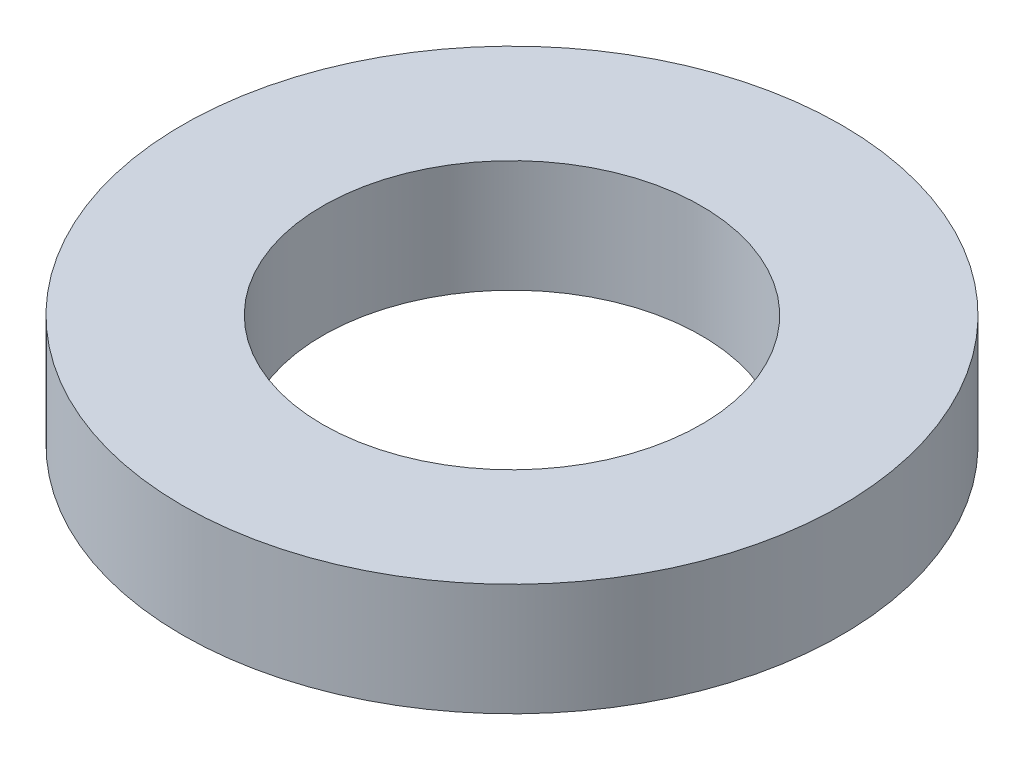
ISO-10303-21;
HEADER;
FILE_DESCRIPTION(('STEP AP214'),'2;1');
FILE_NAME('part.step','',(''),(''),'','','');
FILE_SCHEMA(('AUTOMOTIVE_DESIGN { 1 0 10303 214 1 1 1 1 }'));
ENDSEC;
DATA;
#1=APPLICATION_CONTEXT('core data for automotive mechanical design processes');
#2=APPLICATION_PROTOCOL_DEFINITION('international standard','automotive_design',2000,#1);
#3=PRODUCT_CONTEXT('',#1,'mechanical');
#4=PRODUCT('Part','Part','',(#3));
#5=PRODUCT_RELATED_PRODUCT_CATEGORY('part','',(#4));
#6=PRODUCT_DEFINITION_FORMATION('','',#4);
#7=PRODUCT_DEFINITION_CONTEXT('part definition',#1,'design');
#8=PRODUCT_DEFINITION('design','',#6,#7);
#9=PRODUCT_DEFINITION_SHAPE('','',#8);
#10=(LENGTH_UNIT() NAMED_UNIT(*) SI_UNIT(.MILLI.,.METRE.));
#11=(NAMED_UNIT(*) PLANE_ANGLE_UNIT() SI_UNIT($,.RADIAN.));
#12=(NAMED_UNIT(*) SI_UNIT($,.STERADIAN.) SOLID_ANGLE_UNIT());
#13=UNCERTAINTY_MEASURE_WITH_UNIT(LENGTH_MEASURE(1.E-05),#10,'distance_accuracy_value','');
#14=(GEOMETRIC_REPRESENTATION_CONTEXT(3) GLOBAL_UNCERTAINTY_ASSIGNED_CONTEXT((#13)) GLOBAL_UNIT_ASSIGNED_CONTEXT((#10,
#11,#12)) REPRESENTATION_CONTEXT('',''));
#15=CARTESIAN_POINT('',(0.,0.,0.));
#16=DIRECTION('',(0.,0.,1.));
#17=DIRECTION('',(1.,0.,0.));
#18=AXIS2_PLACEMENT_3D('',#15,#16,#17);
#19=CARTESIAN_POINT('',(0.,2.,0.));
#20=DIRECTION('',(0.,1.,0.));
#21=DIRECTION('',(0.,0.,1.));
#22=AXIS2_PLACEMENT_3D('',#19,#20,#21);
#23=PLANE('',#22);
#24=CARTESIAN_POINT('',(0.,2.,0.));
#25=DIRECTION('',(0.,1.,0.));
#26=DIRECTION('',(0.,0.,1.));
#27=AXIS2_PLACEMENT_3D('',#24,#25,#26);
#28=CIRCLE('',#27,11.75);
#29=CARTESIAN_POINT('',(0.,2.,11.75));
#30=VERTEX_POINT('',#29);
#31=EDGE_CURVE('E10',#30,#30,#28,.T.);
#32=ORIENTED_EDGE('',*,*,#31,.T.);
#33=EDGE_LOOP('',(#32));
#34=FACE_BOUND('',#33,.T.);
#35=CARTESIAN_POINT('',(0.,2.,0.));
#36=DIRECTION('',(0.,1.,0.));
#37=DIRECTION('',(0.,0.,1.));
#38=AXIS2_PLACEMENT_3D('',#35,#36,#37);
#39=CIRCLE('',#38,6.75);
#40=CARTESIAN_POINT('',(0.,2.,6.75));
#41=VERTEX_POINT('',#40);
#42=EDGE_CURVE('E41',#41,#41,#39,.T.);
#43=ORIENTED_EDGE('',*,*,#42,.F.);
#44=EDGE_LOOP('',(#43));
#45=FACE_BOUND('',#44,.T.);
#46=ADVANCED_FACE('F30',(#34,#45),#23,.T.);
#47=CARTESIAN_POINT('',(0.,-2.,0.));
#48=DIRECTION('',(0.,1.,0.));
#49=DIRECTION('',(0.,0.,1.));
#50=AXIS2_PLACEMENT_3D('',#47,#48,#49);
#51=PLANE('',#50);
#52=CARTESIAN_POINT('',(0.,-2.,0.));
#53=DIRECTION('',(0.,1.,0.));
#54=DIRECTION('',(0.,0.,1.));
#55=AXIS2_PLACEMENT_3D('',#52,#53,#54);
#56=CIRCLE('',#55,11.75);
#57=CARTESIAN_POINT('',(0.,-2.,11.75));
#58=VERTEX_POINT('',#57);
#59=EDGE_CURVE('E34',#58,#58,#56,.T.);
#60=ORIENTED_EDGE('',*,*,#59,.F.);
#61=EDGE_LOOP('',(#60));
#62=FACE_BOUND('',#61,.T.);
#63=CARTESIAN_POINT('',(0.,-2.,0.));
#64=DIRECTION('',(0.,1.,0.));
#65=DIRECTION('',(0.,0.,1.));
#66=AXIS2_PLACEMENT_3D('',#63,#64,#65);
#67=CIRCLE('',#66,6.75);
#68=CARTESIAN_POINT('',(0.,-2.,6.75));
#69=VERTEX_POINT('',#68);
#70=EDGE_CURVE('E43',#69,#69,#67,.T.);
#71=ORIENTED_EDGE('',*,*,#70,.T.);
#72=EDGE_LOOP('',(#71));
#73=FACE_BOUND('',#72,.T.);
#74=ADVANCED_FACE('F53',(#62,#73),#51,.F.);
#75=CARTESIAN_POINT('',(0.,2.,0.));
#76=DIRECTION('',(0.,-1.,0.));
#77=DIRECTION('',(0.,0.,-1.));
#78=AXIS2_PLACEMENT_3D('',#75,#76,#77);
#79=CYLINDRICAL_SURFACE('',#78,11.75);
#80=ORIENTED_EDGE('',*,*,#31,.F.);
#81=EDGE_LOOP('',(#80));
#82=FACE_BOUND('',#81,.T.);
#83=ORIENTED_EDGE('',*,*,#59,.T.);
#84=EDGE_LOOP('',(#83));
#85=FACE_BOUND('',#84,.T.);
#86=ADVANCED_FACE('F32',(#82,#85),#79,.T.);
#87=CARTESIAN_POINT('',(0.,2.,0.));
#88=DIRECTION('',(0.,-1.,0.));
#89=DIRECTION('',(0.,0.,-1.));
#90=AXIS2_PLACEMENT_3D('',#87,#88,#89);
#91=CYLINDRICAL_SURFACE('',#90,6.75);
#92=ORIENTED_EDGE('',*,*,#42,.T.);
#93=EDGE_LOOP('',(#92));
#94=FACE_BOUND('',#93,.T.);
#95=ORIENTED_EDGE('',*,*,#70,.F.);
#96=EDGE_LOOP('',(#95));
#97=FACE_BOUND('',#96,.T.);
#98=ADVANCED_FACE('F49',(#94,#97),#91,.F.);
#99=CLOSED_SHELL('',(#46,#74,#86,#98));
#100=MANIFOLD_SOLID_BREP('B2',#99);
#101=ADVANCED_BREP_SHAPE_REPRESENTATION('',(#18,#100),#14);
#102=SHAPE_DEFINITION_REPRESENTATION(#9,#101);
ENDSEC;
END-ISO-10303-21;
